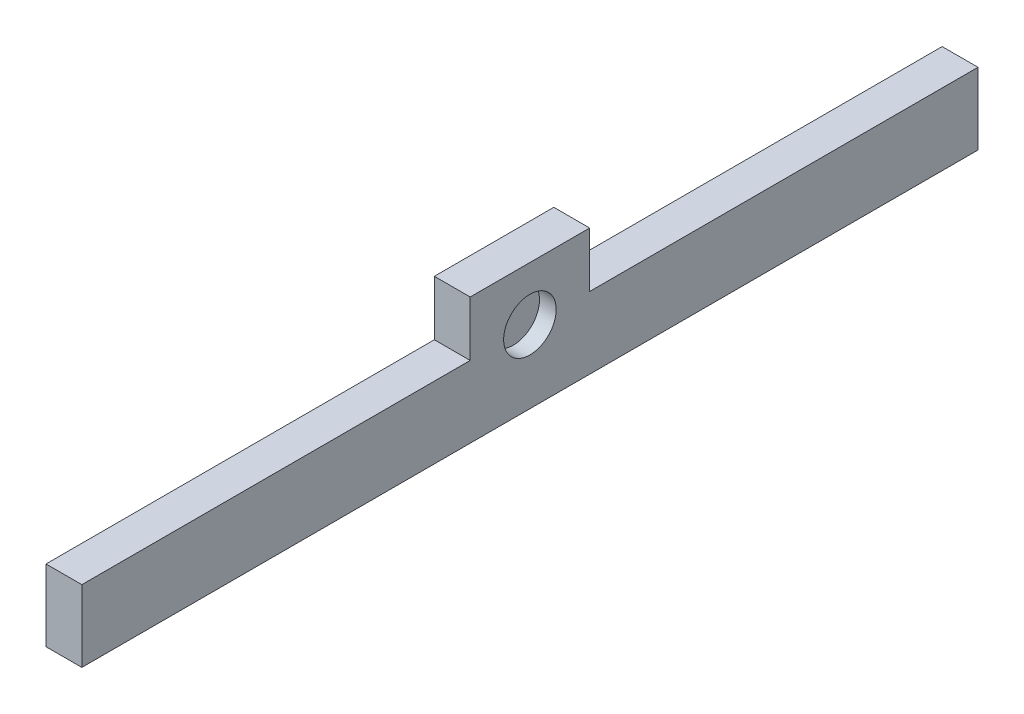
ISO-10303-21;
HEADER;
FILE_DESCRIPTION(('STEP AP214'),'2;1');
FILE_NAME('part.step','',(''),(''),'','','');
FILE_SCHEMA(('AUTOMOTIVE_DESIGN { 1 0 10303 214 1 1 1 1 }'));
ENDSEC;
DATA;
#1=APPLICATION_CONTEXT('core data for automotive mechanical design processes');
#2=APPLICATION_PROTOCOL_DEFINITION('international standard','automotive_design',2000,#1);
#3=PRODUCT_CONTEXT('',#1,'mechanical');
#4=PRODUCT('Part','Part','',(#3));
#5=PRODUCT_RELATED_PRODUCT_CATEGORY('part','',(#4));
#6=PRODUCT_DEFINITION_FORMATION('','',#4);
#7=PRODUCT_DEFINITION_CONTEXT('part definition',#1,'design');
#8=PRODUCT_DEFINITION('design','',#6,#7);
#9=PRODUCT_DEFINITION_SHAPE('','',#8);
#10=(LENGTH_UNIT() NAMED_UNIT(*) SI_UNIT(.MILLI.,.METRE.));
#11=(NAMED_UNIT(*) PLANE_ANGLE_UNIT() SI_UNIT($,.RADIAN.));
#12=(NAMED_UNIT(*) SI_UNIT($,.STERADIAN.) SOLID_ANGLE_UNIT());
#13=UNCERTAINTY_MEASURE_WITH_UNIT(LENGTH_MEASURE(1.E-05),#10,'distance_accuracy_value','');
#14=(GEOMETRIC_REPRESENTATION_CONTEXT(3) GLOBAL_UNCERTAINTY_ASSIGNED_CONTEXT((#13)) GLOBAL_UNIT_ASSIGNED_CONTEXT((#10,
#11,#12)) REPRESENTATION_CONTEXT('',''));
#15=CARTESIAN_POINT('',(0.,0.,0.));
#16=DIRECTION('',(0.,0.,1.));
#17=DIRECTION('',(1.,0.,0.));
#18=AXIS2_PLACEMENT_3D('',#15,#16,#17);
#19=CARTESIAN_POINT('',(15.,30.,-25.));
#20=DIRECTION('',(0.,0.,1.));
#21=DIRECTION('',(0.,-1.,0.));
#22=AXIS2_PLACEMENT_3D('',#19,#20,#21);
#23=PLANE('',#22);
#24=DIRECTION('',(0.,1.,0.));
#25=VECTOR('',#24,1.);
#26=CARTESIAN_POINT('',(0.,30.,-25.));
#27=LINE('',#26,#25);
#28=CARTESIAN_POINT('',(0.,30.,-25.));
#29=VERTEX_POINT('',#28);
#30=CARTESIAN_POINT('',(0.,53.,-25.));
#31=VERTEX_POINT('',#30);
#32=EDGE_CURVE('E129',#29,#31,#27,.T.);
#33=ORIENTED_EDGE('',*,*,#32,.T.);
#34=DIRECTION('',(-1.,0.,0.));
#35=VECTOR('',#34,1.);
#36=CARTESIAN_POINT('',(15.,53.,-25.));
#37=LINE('',#36,#35);
#38=CARTESIAN_POINT('',(15.,53.,-25.));
#39=VERTEX_POINT('',#38);
#40=EDGE_CURVE('E11',#39,#31,#37,.T.);
#41=ORIENTED_EDGE('',*,*,#40,.F.);
#42=DIRECTION('',(0.,1.,0.));
#43=VECTOR('',#42,1.);
#44=CARTESIAN_POINT('',(15.,30.,-25.));
#45=LINE('',#44,#43);
#46=CARTESIAN_POINT('',(15.,30.,-25.));
#47=VERTEX_POINT('',#46);
#48=EDGE_CURVE('E144',#47,#39,#45,.T.);
#49=ORIENTED_EDGE('',*,*,#48,.F.);
#50=DIRECTION('',(-1.,0.,0.));
#51=VECTOR('',#50,1.);
#52=CARTESIAN_POINT('',(15.,30.,-25.));
#53=LINE('',#52,#51);
#54=EDGE_CURVE('E125',#47,#29,#53,.T.);
#55=ORIENTED_EDGE('',*,*,#54,.T.);
#56=EDGE_LOOP('',(#33,#41,#49,#55));
#57=FACE_BOUND('',#56,.T.);
#58=ADVANCED_FACE('F33',(#57),#23,.F.);
#59=CARTESIAN_POINT('',(15.,53.,25.));
#60=DIRECTION('',(0.,-1.,0.));
#61=DIRECTION('',(0.,0.,-1.));
#62=AXIS2_PLACEMENT_3D('',#59,#60,#61);
#63=PLANE('',#62);
#64=DIRECTION('',(0.,0.,1.));
#65=VECTOR('',#64,1.);
#66=CARTESIAN_POINT('',(0.,53.,25.));
#67=LINE('',#66,#65);
#68=CARTESIAN_POINT('',(0.,53.,25.));
#69=VERTEX_POINT('',#68);
#70=EDGE_CURVE('E132',#31,#69,#67,.T.);
#71=ORIENTED_EDGE('',*,*,#70,.T.);
#72=DIRECTION('',(-1.,0.,0.));
#73=VECTOR('',#72,1.);
#74=CARTESIAN_POINT('',(15.,53.,25.));
#75=LINE('',#74,#73);
#76=CARTESIAN_POINT('',(15.,53.,25.));
#77=VERTEX_POINT('',#76);
#78=EDGE_CURVE('E41',#77,#69,#75,.T.);
#79=ORIENTED_EDGE('',*,*,#78,.F.);
#80=DIRECTION('',(0.,0.,1.));
#81=VECTOR('',#80,1.);
#82=CARTESIAN_POINT('',(15.,53.,25.));
#83=LINE('',#82,#81);
#84=EDGE_CURVE('E92',#39,#77,#83,.T.);
#85=ORIENTED_EDGE('',*,*,#84,.F.);
#86=ORIENTED_EDGE('',*,*,#40,.T.);
#87=EDGE_LOOP('',(#71,#79,#85,#86));
#88=FACE_BOUND('',#87,.T.);
#89=ADVANCED_FACE('F201',(#88),#63,.F.);
#90=CARTESIAN_POINT('',(15.,30.,25.));
#91=DIRECTION('',(0.,0.,-1.));
#92=DIRECTION('',(-1.,0.,0.));
#93=AXIS2_PLACEMENT_3D('',#90,#91,#92);
#94=PLANE('',#93);
#95=DIRECTION('',(0.,-1.,0.));
#96=VECTOR('',#95,1.);
#97=CARTESIAN_POINT('',(0.,30.,25.));
#98=LINE('',#97,#96);
#99=CARTESIAN_POINT('',(0.,30.,25.));
#100=VERTEX_POINT('',#99);
#101=EDGE_CURVE('E135',#69,#100,#98,.T.);
#102=ORIENTED_EDGE('',*,*,#101,.T.);
#103=DIRECTION('',(-1.,0.,0.));
#104=VECTOR('',#103,1.);
#105=CARTESIAN_POINT('',(15.,30.,25.));
#106=LINE('',#105,#104);
#107=CARTESIAN_POINT('',(15.,30.,25.));
#108=VERTEX_POINT('',#107);
#109=EDGE_CURVE('E151',#108,#100,#106,.T.);
#110=ORIENTED_EDGE('',*,*,#109,.F.);
#111=DIRECTION('',(0.,-1.,0.));
#112=VECTOR('',#111,1.);
#113=CARTESIAN_POINT('',(15.,30.,25.));
#114=LINE('',#113,#112);
#115=EDGE_CURVE('E159',#77,#108,#114,.T.);
#116=ORIENTED_EDGE('',*,*,#115,.F.);
#117=ORIENTED_EDGE('',*,*,#78,.T.);
#118=EDGE_LOOP('',(#102,#110,#116,#117));
#119=FACE_BOUND('',#118,.T.);
#120=ADVANCED_FACE('F157',(#119),#94,.F.);
#121=CARTESIAN_POINT('',(15.,30.,25.));
#122=DIRECTION('',(0.,-1.,0.));
#123=DIRECTION('',(0.,0.,-1.));
#124=AXIS2_PLACEMENT_3D('',#121,#122,#123);
#125=PLANE('',#124);
#126=DIRECTION('',(0.,0.,1.));
#127=VECTOR('',#126,1.);
#128=CARTESIAN_POINT('',(0.,30.,25.));
#129=LINE('',#128,#127);
#130=CARTESIAN_POINT('',(0.,30.,187.5));
#131=VERTEX_POINT('',#130);
#132=EDGE_CURVE('E137',#100,#131,#129,.T.);
#133=ORIENTED_EDGE('',*,*,#132,.T.);
#134=DIRECTION('',(-1.,0.,0.));
#135=VECTOR('',#134,1.);
#136=CARTESIAN_POINT('',(15.,30.,187.5));
#137=LINE('',#136,#135);
#138=CARTESIAN_POINT('',(15.,30.,187.5));
#139=VERTEX_POINT('',#138);
#140=EDGE_CURVE('E148',#139,#131,#137,.T.);
#141=ORIENTED_EDGE('',*,*,#140,.F.);
#142=DIRECTION('',(0.,0.,1.));
#143=VECTOR('',#142,1.);
#144=CARTESIAN_POINT('',(15.,30.,25.));
#145=LINE('',#144,#143);
#146=EDGE_CURVE('E171',#108,#139,#145,.T.);
#147=ORIENTED_EDGE('',*,*,#146,.F.);
#148=ORIENTED_EDGE('',*,*,#109,.T.);
#149=EDGE_LOOP('',(#133,#141,#147,#148));
#150=FACE_BOUND('',#149,.T.);
#151=ADVANCED_FACE('F167',(#150),#125,.F.);
#152=CARTESIAN_POINT('',(15.,0.,187.5));
#153=DIRECTION('',(0.,0.,-1.));
#154=DIRECTION('',(-1.,0.,0.));
#155=AXIS2_PLACEMENT_3D('',#152,#153,#154);
#156=PLANE('',#155);
#157=DIRECTION('',(0.,-1.,0.));
#158=VECTOR('',#157,1.);
#159=CARTESIAN_POINT('',(0.,0.,187.5));
#160=LINE('',#159,#158);
#161=CARTESIAN_POINT('',(0.,0.,187.5));
#162=VERTEX_POINT('',#161);
#163=EDGE_CURVE('E139',#131,#162,#160,.T.);
#164=ORIENTED_EDGE('',*,*,#163,.T.);
#165=DIRECTION('',(-1.,0.,0.));
#166=VECTOR('',#165,1.);
#167=CARTESIAN_POINT('',(15.,0.,187.5));
#168=LINE('',#167,#166);
#169=CARTESIAN_POINT('',(15.,0.,187.5));
#170=VERTEX_POINT('',#169);
#171=EDGE_CURVE('E120',#170,#162,#168,.T.);
#172=ORIENTED_EDGE('',*,*,#171,.F.);
#173=DIRECTION('',(0.,-1.,0.));
#174=VECTOR('',#173,1.);
#175=CARTESIAN_POINT('',(15.,0.,187.5));
#176=LINE('',#175,#174);
#177=EDGE_CURVE('E111',#139,#170,#176,.T.);
#178=ORIENTED_EDGE('',*,*,#177,.F.);
#179=ORIENTED_EDGE('',*,*,#140,.T.);
#180=EDGE_LOOP('',(#164,#172,#178,#179));
#181=FACE_BOUND('',#180,.T.);
#182=ADVANCED_FACE('F170',(#181),#156,.F.);
#183=CARTESIAN_POINT('',(15.,0.,187.5));
#184=DIRECTION('',(0.,1.,0.));
#185=DIRECTION('',(0.,0.,1.));
#186=AXIS2_PLACEMENT_3D('',#183,#184,#185);
#187=PLANE('',#186);
#188=DIRECTION('',(0.,0.,-1.));
#189=VECTOR('',#188,1.);
#190=CARTESIAN_POINT('',(0.,0.,187.5));
#191=LINE('',#190,#189);
#192=CARTESIAN_POINT('',(0.,0.,-187.5));
#193=VERTEX_POINT('',#192);
#194=EDGE_CURVE('E119',#162,#193,#191,.T.);
#195=ORIENTED_EDGE('',*,*,#194,.T.);
#196=DIRECTION('',(-1.,0.,0.));
#197=VECTOR('',#196,1.);
#198=CARTESIAN_POINT('',(15.,0.,-187.5));
#199=LINE('',#198,#197);
#200=CARTESIAN_POINT('',(15.,0.,-187.5));
#201=VERTEX_POINT('',#200);
#202=EDGE_CURVE('E116',#201,#193,#199,.T.);
#203=ORIENTED_EDGE('',*,*,#202,.F.);
#204=DIRECTION('',(0.,0.,-1.));
#205=VECTOR('',#204,1.);
#206=CARTESIAN_POINT('',(15.,0.,187.5));
#207=LINE('',#206,#205);
#208=EDGE_CURVE('E105',#170,#201,#207,.T.);
#209=ORIENTED_EDGE('',*,*,#208,.F.);
#210=ORIENTED_EDGE('',*,*,#171,.T.);
#211=EDGE_LOOP('',(#195,#203,#209,#210));
#212=FACE_BOUND('',#211,.T.);
#213=ADVANCED_FACE('F117',(#212),#187,.F.);
#214=CARTESIAN_POINT('',(15.,0.,-187.5));
#215=DIRECTION('',(0.,0.,1.));
#216=DIRECTION('',(1.,0.,0.));
#217=AXIS2_PLACEMENT_3D('',#214,#215,#216);
#218=PLANE('',#217);
#219=DIRECTION('',(0.,1.,0.));
#220=VECTOR('',#219,1.);
#221=CARTESIAN_POINT('',(0.,0.,-187.5));
#222=LINE('',#221,#220);
#223=CARTESIAN_POINT('',(0.,30.0000000000001,-187.5));
#224=VERTEX_POINT('',#223);
#225=EDGE_CURVE('E78',#193,#224,#222,.T.);
#226=ORIENTED_EDGE('',*,*,#225,.T.);
#227=DIRECTION('',(-1.,0.,0.));
#228=VECTOR('',#227,1.);
#229=CARTESIAN_POINT('',(15.,30.0000000000001,-187.5));
#230=LINE('',#229,#228);
#231=CARTESIAN_POINT('',(15.,30.0000000000001,-187.5));
#232=VERTEX_POINT('',#231);
#233=EDGE_CURVE('E121',#232,#224,#230,.T.);
#234=ORIENTED_EDGE('',*,*,#233,.F.);
#235=DIRECTION('',(0.,1.,0.));
#236=VECTOR('',#235,1.);
#237=CARTESIAN_POINT('',(15.,0.,-187.5));
#238=LINE('',#237,#236);
#239=EDGE_CURVE('E109',#201,#232,#238,.T.);
#240=ORIENTED_EDGE('',*,*,#239,.F.);
#241=ORIENTED_EDGE('',*,*,#202,.T.);
#242=EDGE_LOOP('',(#226,#234,#240,#241));
#243=FACE_BOUND('',#242,.T.);
#244=ADVANCED_FACE('F123',(#243),#218,.F.);
#245=CARTESIAN_POINT('',(15.,30.,-25.));
#246=DIRECTION('',(0.,-1.,0.));
#247=DIRECTION('',(0.,0.,-1.));
#248=AXIS2_PLACEMENT_3D('',#245,#246,#247);
#249=PLANE('',#248);
#250=DIRECTION('',(0.,0.,1.));
#251=VECTOR('',#250,1.);
#252=CARTESIAN_POINT('',(0.,30.,-25.));
#253=LINE('',#252,#251);
#254=EDGE_CURVE('E84',#224,#29,#253,.T.);
#255=ORIENTED_EDGE('',*,*,#254,.T.);
#256=ORIENTED_EDGE('',*,*,#54,.F.);
#257=DIRECTION('',(0.,0.,1.));
#258=VECTOR('',#257,1.);
#259=CARTESIAN_POINT('',(15.,30.,-25.));
#260=LINE('',#259,#258);
#261=EDGE_CURVE('E49',#232,#47,#260,.T.);
#262=ORIENTED_EDGE('',*,*,#261,.F.);
#263=ORIENTED_EDGE('',*,*,#233,.T.);
#264=EDGE_LOOP('',(#255,#256,#262,#263));
#265=FACE_BOUND('',#264,.T.);
#266=ADVANCED_FACE('F192',(#265),#249,.F.);
#267=CARTESIAN_POINT('',(15.,0.,0.));
#268=DIRECTION('',(-1.,0.,0.));
#269=DIRECTION('',(0.,0.,1.));
#270=AXIS2_PLACEMENT_3D('',#267,#268,#269);
#271=PLANE('',#270);
#272=CARTESIAN_POINT('',(15.,30.5,0.));
#273=DIRECTION('',(1.,0.,0.));
#274=DIRECTION('',(0.,0.,-1.));
#275=AXIS2_PLACEMENT_3D('',#272,#273,#274);
#276=CIRCLE('',#275,11.);
#277=CARTESIAN_POINT('',(15.,30.5,-11.));
#278=VERTEX_POINT('',#277);
#279=EDGE_CURVE('E177',#278,#278,#276,.T.);
#280=ORIENTED_EDGE('',*,*,#279,.F.);
#281=EDGE_LOOP('',(#280));
#282=FACE_BOUND('',#281,.T.);
#283=ORIENTED_EDGE('',*,*,#48,.T.);
#284=ORIENTED_EDGE('',*,*,#84,.T.);
#285=ORIENTED_EDGE('',*,*,#115,.T.);
#286=ORIENTED_EDGE('',*,*,#146,.T.);
#287=ORIENTED_EDGE('',*,*,#177,.T.);
#288=ORIENTED_EDGE('',*,*,#208,.T.);
#289=ORIENTED_EDGE('',*,*,#239,.T.);
#290=ORIENTED_EDGE('',*,*,#261,.T.);
#291=EDGE_LOOP('',(#283,#284,#285,#286,#287,#288,#289,#290));
#292=FACE_BOUND('',#291,.T.);
#293=ADVANCED_FACE('F107',(#282,#292),#271,.F.);
#294=CARTESIAN_POINT('',(0.,0.,0.));
#295=DIRECTION('',(-1.,0.,0.));
#296=DIRECTION('',(0.,0.,1.));
#297=AXIS2_PLACEMENT_3D('',#294,#295,#296);
#298=PLANE('',#297);
#299=ORIENTED_EDGE('',*,*,#32,.F.);
#300=ORIENTED_EDGE('',*,*,#254,.F.);
#301=ORIENTED_EDGE('',*,*,#225,.F.);
#302=ORIENTED_EDGE('',*,*,#194,.F.);
#303=ORIENTED_EDGE('',*,*,#163,.F.);
#304=ORIENTED_EDGE('',*,*,#132,.F.);
#305=ORIENTED_EDGE('',*,*,#101,.F.);
#306=ORIENTED_EDGE('',*,*,#70,.F.);
#307=EDGE_LOOP('',(#299,#300,#301,#302,#303,#304,#305,#306));
#308=FACE_BOUND('',#307,.T.);
#309=ADVANCED_FACE('F163',(#308),#298,.T.);
#310=CARTESIAN_POINT('',(8.,30.5,0.));
#311=DIRECTION('',(1.,0.,0.));
#312=DIRECTION('',(0.,0.,-1.));
#313=AXIS2_PLACEMENT_3D('',#310,#311,#312);
#314=CYLINDRICAL_SURFACE('',#313,11.);
#315=CARTESIAN_POINT('',(8.,30.5,0.));
#316=DIRECTION('',(1.,0.,0.));
#317=DIRECTION('',(0.,0.,-1.));
#318=AXIS2_PLACEMENT_3D('',#315,#316,#317);
#319=CIRCLE('',#318,11.);
#320=CARTESIAN_POINT('',(8.,30.5,-11.));
#321=VERTEX_POINT('',#320);
#322=EDGE_CURVE('E133',#321,#321,#319,.T.);
#323=ORIENTED_EDGE('',*,*,#322,.F.);
#324=EDGE_LOOP('',(#323));
#325=FACE_BOUND('',#324,.T.);
#326=ORIENTED_EDGE('',*,*,#279,.T.);
#327=EDGE_LOOP('',(#326));
#328=FACE_BOUND('',#327,.T.);
#329=ADVANCED_FACE('F185',(#325,#328),#314,.F.);
#330=CARTESIAN_POINT('',(8.,30.5,0.));
#331=DIRECTION('',(1.,0.,0.));
#332=DIRECTION('',(0.,0.,-1.));
#333=AXIS2_PLACEMENT_3D('',#330,#331,#332);
#334=PLANE('',#333);
#335=ORIENTED_EDGE('',*,*,#322,.T.);
#336=EDGE_LOOP('',(#335));
#337=FACE_BOUND('',#336,.T.);
#338=ADVANCED_FACE('F183',(#337),#334,.T.);
#339=CLOSED_SHELL('',(#58,#89,#120,#151,#182,#213,#244,#266,#293,#309,#329,#338));
#340=MANIFOLD_SOLID_BREP('B2',#339);
#341=ADVANCED_BREP_SHAPE_REPRESENTATION('',(#18,#340),#14);
#342=SHAPE_DEFINITION_REPRESENTATION(#9,#341);
ENDSEC;
END-ISO-10303-21;
